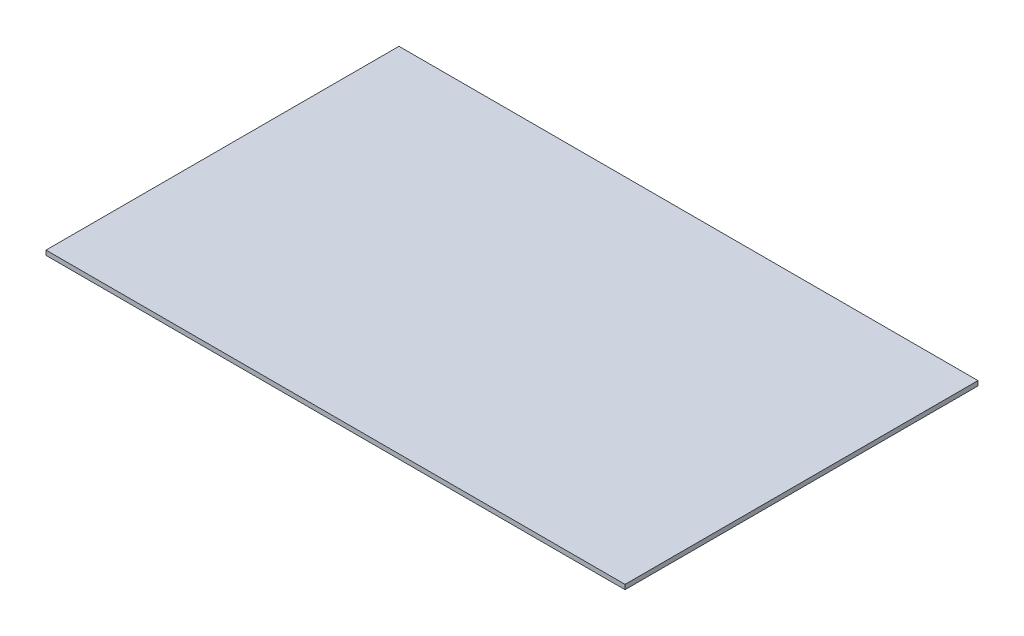
ISO-10303-21;
HEADER;
FILE_DESCRIPTION(('STEP AP214'),'2;1');
FILE_NAME('part.step','',(''),(''),'','','');
FILE_SCHEMA(('AUTOMOTIVE_DESIGN { 1 0 10303 214 1 1 1 1 }'));
ENDSEC;
DATA;
#1=APPLICATION_CONTEXT('core data for automotive mechanical design processes');
#2=APPLICATION_PROTOCOL_DEFINITION('international standard','automotive_design',2000,#1);
#3=PRODUCT_CONTEXT('',#1,'mechanical');
#4=PRODUCT('Part','Part','',(#3));
#5=PRODUCT_RELATED_PRODUCT_CATEGORY('part','',(#4));
#6=PRODUCT_DEFINITION_FORMATION('','',#4);
#7=PRODUCT_DEFINITION_CONTEXT('part definition',#1,'design');
#8=PRODUCT_DEFINITION('design','',#6,#7);
#9=PRODUCT_DEFINITION_SHAPE('','',#8);
#10=(LENGTH_UNIT() NAMED_UNIT(*) SI_UNIT(.MILLI.,.METRE.));
#11=(NAMED_UNIT(*) PLANE_ANGLE_UNIT() SI_UNIT($,.RADIAN.));
#12=(NAMED_UNIT(*) SI_UNIT($,.STERADIAN.) SOLID_ANGLE_UNIT());
#13=UNCERTAINTY_MEASURE_WITH_UNIT(LENGTH_MEASURE(1.E-05),#10,'distance_accuracy_value','');
#14=(GEOMETRIC_REPRESENTATION_CONTEXT(3) GLOBAL_UNCERTAINTY_ASSIGNED_CONTEXT((#13)) GLOBAL_UNIT_ASSIGNED_CONTEXT((#10,
#11,#12)) REPRESENTATION_CONTEXT('',''));
#15=CARTESIAN_POINT('',(0.,0.,0.));
#16=DIRECTION('',(0.,0.,1.));
#17=DIRECTION('',(1.,0.,0.));
#18=AXIS2_PLACEMENT_3D('',#15,#16,#17);
#19=CARTESIAN_POINT('',(-135.60406779661,3.,-74.5116101694916));
#20=DIRECTION('',(1.,0.,0.));
#21=DIRECTION('',(0.,0.,-1.));
#22=AXIS2_PLACEMENT_3D('',#19,#20,#21);
#23=PLANE('',#22);
#24=DIRECTION('',(0.,0.,1.));
#25=VECTOR('',#24,1.);
#26=CARTESIAN_POINT('',(-135.60406779661,0.,-74.5116101694916));
#27=LINE('',#26,#25);
#28=CARTESIAN_POINT('',(-135.60406779661,0.,-74.5116101694916));
#29=VERTEX_POINT('',#28);
#30=CARTESIAN_POINT('',(-135.60406779661,0.,154.103389830508));
#31=VERTEX_POINT('',#30);
#32=EDGE_CURVE('E95',#29,#31,#27,.T.);
#33=ORIENTED_EDGE('',*,*,#32,.T.);
#34=DIRECTION('',(0.,-1.,0.));
#35=VECTOR('',#34,1.);
#36=CARTESIAN_POINT('',(-135.60406779661,3.,154.103389830508));
#37=LINE('',#36,#35);
#38=CARTESIAN_POINT('',(-135.60406779661,3.,154.103389830508));
#39=VERTEX_POINT('',#38);
#40=EDGE_CURVE('E11',#39,#31,#37,.T.);
#41=ORIENTED_EDGE('',*,*,#40,.F.);
#42=DIRECTION('',(0.,0.,1.));
#43=VECTOR('',#42,1.);
#44=CARTESIAN_POINT('',(-135.60406779661,3.,-74.5116101694916));
#45=LINE('',#44,#43);
#46=CARTESIAN_POINT('',(-135.60406779661,3.,-74.5116101694916));
#47=VERTEX_POINT('',#46);
#48=EDGE_CURVE('E83',#47,#39,#45,.T.);
#49=ORIENTED_EDGE('',*,*,#48,.F.);
#50=DIRECTION('',(0.,-1.,0.));
#51=VECTOR('',#50,1.);
#52=CARTESIAN_POINT('',(-135.60406779661,3.,-74.5116101694916));
#53=LINE('',#52,#51);
#54=EDGE_CURVE('E91',#47,#29,#53,.T.);
#55=ORIENTED_EDGE('',*,*,#54,.T.);
#56=EDGE_LOOP('',(#33,#41,#49,#55));
#57=FACE_BOUND('',#56,.T.);
#58=ADVANCED_FACE('F32',(#57),#23,.F.);
#59=CARTESIAN_POINT('',(-135.60406779661,3.,154.103389830508));
#60=DIRECTION('',(0.,0.,-1.));
#61=DIRECTION('',(-1.,0.,0.));
#62=AXIS2_PLACEMENT_3D('',#59,#60,#61);
#63=PLANE('',#62);
#64=DIRECTION('',(1.,0.,0.));
#65=VECTOR('',#64,1.);
#66=CARTESIAN_POINT('',(-135.60406779661,0.,154.103389830508));
#67=LINE('',#66,#65);
#68=CARTESIAN_POINT('',(239.42593220339,0.,154.103389830508));
#69=VERTEX_POINT('',#68);
#70=EDGE_CURVE('E87',#31,#69,#67,.T.);
#71=ORIENTED_EDGE('',*,*,#70,.T.);
#72=DIRECTION('',(0.,-1.,0.));
#73=VECTOR('',#72,1.);
#74=CARTESIAN_POINT('',(239.42593220339,3.,154.103389830508));
#75=LINE('',#74,#73);
#76=CARTESIAN_POINT('',(239.42593220339,3.,154.103389830508));
#77=VERTEX_POINT('',#76);
#78=EDGE_CURVE('E40',#77,#69,#75,.T.);
#79=ORIENTED_EDGE('',*,*,#78,.F.);
#80=DIRECTION('',(1.,0.,0.));
#81=VECTOR('',#80,1.);
#82=CARTESIAN_POINT('',(-135.60406779661,3.,154.103389830508));
#83=LINE('',#82,#81);
#84=EDGE_CURVE('E78',#39,#77,#83,.T.);
#85=ORIENTED_EDGE('',*,*,#84,.F.);
#86=ORIENTED_EDGE('',*,*,#40,.T.);
#87=EDGE_LOOP('',(#71,#79,#85,#86));
#88=FACE_BOUND('',#87,.T.);
#89=ADVANCED_FACE('F86',(#88),#63,.F.);
#90=CARTESIAN_POINT('',(239.42593220339,3.,-74.5116101694916));
#91=DIRECTION('',(-1.,0.,0.));
#92=DIRECTION('',(0.,0.,1.));
#93=AXIS2_PLACEMENT_3D('',#90,#91,#92);
#94=PLANE('',#93);
#95=DIRECTION('',(0.,0.,-1.));
#96=VECTOR('',#95,1.);
#97=CARTESIAN_POINT('',(239.42593220339,0.,-74.5116101694916));
#98=LINE('',#97,#96);
#99=CARTESIAN_POINT('',(239.42593220339,0.,-74.5116101694916));
#100=VERTEX_POINT('',#99);
#101=EDGE_CURVE('E65',#69,#100,#98,.T.);
#102=ORIENTED_EDGE('',*,*,#101,.T.);
#103=DIRECTION('',(0.,-1.,0.));
#104=VECTOR('',#103,1.);
#105=CARTESIAN_POINT('',(239.42593220339,3.,-74.5116101694916));
#106=LINE('',#105,#104);
#107=CARTESIAN_POINT('',(239.42593220339,3.,-74.5116101694916));
#108=VERTEX_POINT('',#107);
#109=EDGE_CURVE('E88',#108,#100,#106,.T.);
#110=ORIENTED_EDGE('',*,*,#109,.F.);
#111=DIRECTION('',(0.,0.,-1.));
#112=VECTOR('',#111,1.);
#113=CARTESIAN_POINT('',(239.42593220339,3.,-74.5116101694916));
#114=LINE('',#113,#112);
#115=EDGE_CURVE('E81',#77,#108,#114,.T.);
#116=ORIENTED_EDGE('',*,*,#115,.F.);
#117=ORIENTED_EDGE('',*,*,#78,.T.);
#118=EDGE_LOOP('',(#102,#110,#116,#117));
#119=FACE_BOUND('',#118,.T.);
#120=ADVANCED_FACE('F89',(#119),#94,.F.);
#121=CARTESIAN_POINT('',(-135.60406779661,3.,-74.5116101694916));
#122=DIRECTION('',(0.,0.,1.));
#123=DIRECTION('',(1.,0.,0.));
#124=AXIS2_PLACEMENT_3D('',#121,#122,#123);
#125=PLANE('',#124);
#126=DIRECTION('',(-1.,0.,0.));
#127=VECTOR('',#126,1.);
#128=CARTESIAN_POINT('',(-135.60406779661,0.,-74.5116101694916));
#129=LINE('',#128,#127);
#130=EDGE_CURVE('E71',#100,#29,#129,.T.);
#131=ORIENTED_EDGE('',*,*,#130,.T.);
#132=ORIENTED_EDGE('',*,*,#54,.F.);
#133=DIRECTION('',(-1.,0.,0.));
#134=VECTOR('',#133,1.);
#135=CARTESIAN_POINT('',(-135.60406779661,3.,-74.5116101694916));
#136=LINE('',#135,#134);
#137=EDGE_CURVE('E48',#108,#47,#136,.T.);
#138=ORIENTED_EDGE('',*,*,#137,.F.);
#139=ORIENTED_EDGE('',*,*,#109,.T.);
#140=EDGE_LOOP('',(#131,#132,#138,#139));
#141=FACE_BOUND('',#140,.T.);
#142=ADVANCED_FACE('F102',(#141),#125,.F.);
#143=CARTESIAN_POINT('',(0.,3.,0.));
#144=DIRECTION('',(0.,1.,0.));
#145=DIRECTION('',(0.,0.,1.));
#146=AXIS2_PLACEMENT_3D('',#143,#144,#145);
#147=PLANE('',#146);
#148=ORIENTED_EDGE('',*,*,#48,.T.);
#149=ORIENTED_EDGE('',*,*,#84,.T.);
#150=ORIENTED_EDGE('',*,*,#115,.T.);
#151=ORIENTED_EDGE('',*,*,#137,.T.);
#152=EDGE_LOOP('',(#148,#149,#150,#151));
#153=FACE_BOUND('',#152,.T.);
#154=ADVANCED_FACE('F79',(#153),#147,.T.);
#155=CARTESIAN_POINT('',(0.,0.,0.));
#156=DIRECTION('',(0.,1.,0.));
#157=DIRECTION('',(0.,0.,1.));
#158=AXIS2_PLACEMENT_3D('',#155,#156,#157);
#159=PLANE('',#158);
#160=ORIENTED_EDGE('',*,*,#32,.F.);
#161=ORIENTED_EDGE('',*,*,#130,.F.);
#162=ORIENTED_EDGE('',*,*,#101,.F.);
#163=ORIENTED_EDGE('',*,*,#70,.F.);
#164=EDGE_LOOP('',(#160,#161,#162,#163));
#165=FACE_BOUND('',#164,.T.);
#166=ADVANCED_FACE('F105',(#165),#159,.F.);
#167=CLOSED_SHELL('',(#58,#89,#120,#142,#154,#166));
#168=MANIFOLD_SOLID_BREP('B2',#167);
#169=ADVANCED_BREP_SHAPE_REPRESENTATION('',(#18,#168),#14);
#170=SHAPE_DEFINITION_REPRESENTATION(#9,#169);
ENDSEC;
END-ISO-10303-21;
